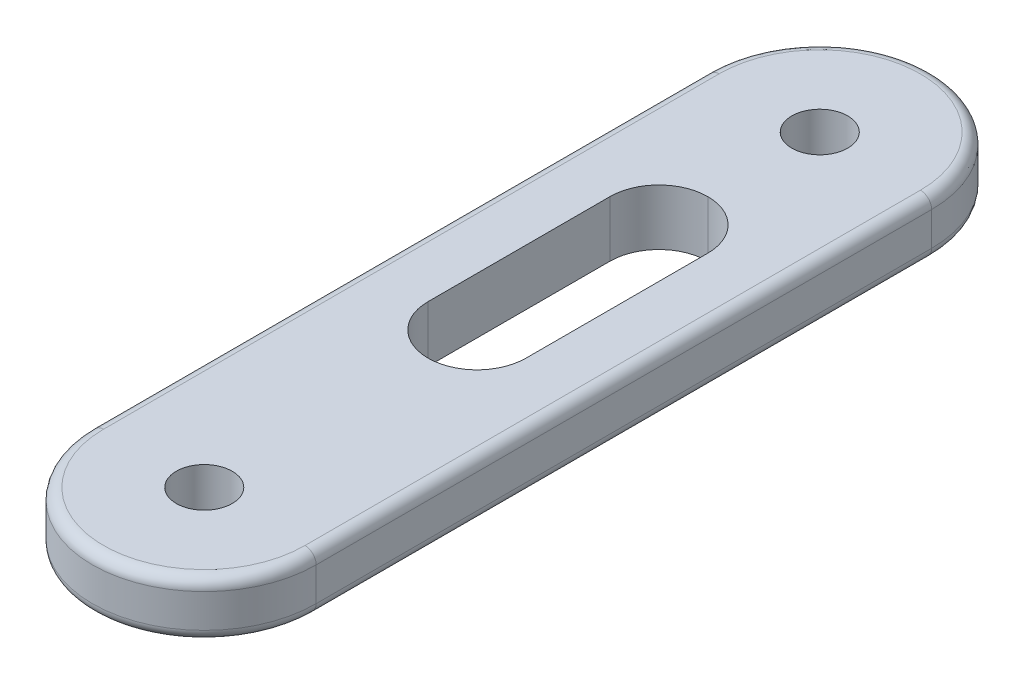
ISO-10303-21;
HEADER;
FILE_DESCRIPTION(('STEP AP214'),'2;1');
FILE_NAME('part.step','',(''),(''),'','','');
FILE_SCHEMA(('AUTOMOTIVE_DESIGN { 1 0 10303 214 1 1 1 1 }'));
ENDSEC;
DATA;
#1=APPLICATION_CONTEXT('core data for automotive mechanical design processes');
#2=APPLICATION_PROTOCOL_DEFINITION('international standard','automotive_design',2000,#1);
#3=PRODUCT_CONTEXT('',#1,'mechanical');
#4=PRODUCT('Part','Part','',(#3));
#5=PRODUCT_RELATED_PRODUCT_CATEGORY('part','',(#4));
#6=PRODUCT_DEFINITION_FORMATION('','',#4);
#7=PRODUCT_DEFINITION_CONTEXT('part definition',#1,'design');
#8=PRODUCT_DEFINITION('design','',#6,#7);
#9=PRODUCT_DEFINITION_SHAPE('','',#8);
#10=(LENGTH_UNIT() NAMED_UNIT(*) SI_UNIT(.MILLI.,.METRE.));
#11=(NAMED_UNIT(*) PLANE_ANGLE_UNIT() SI_UNIT($,.RADIAN.));
#12=(NAMED_UNIT(*) SI_UNIT($,.STERADIAN.) SOLID_ANGLE_UNIT());
#13=UNCERTAINTY_MEASURE_WITH_UNIT(LENGTH_MEASURE(1.E-05),#10,'distance_accuracy_value','');
#14=(GEOMETRIC_REPRESENTATION_CONTEXT(3) GLOBAL_UNCERTAINTY_ASSIGNED_CONTEXT((#13)) GLOBAL_UNIT_ASSIGNED_CONTEXT((#10,
#11,#12)) REPRESENTATION_CONTEXT('',''));
#15=CARTESIAN_POINT('',(0.,0.,0.));
#16=DIRECTION('',(0.,0.,1.));
#17=DIRECTION('',(1.,0.,0.));
#18=AXIS2_PLACEMENT_3D('',#15,#16,#17);
#19=CARTESIAN_POINT('',(0.,6.35,0.));
#20=DIRECTION('',(0.,-1.,0.));
#21=DIRECTION('',(0.,0.,-1.));
#22=AXIS2_PLACEMENT_3D('',#19,#20,#21);
#23=PLANE('',#22);
#24=CARTESIAN_POINT('',(12.7,6.35,-82.55));
#25=DIRECTION('',(0.,-1.,0.));
#26=DIRECTION('',(0.,0.,-1.));
#27=AXIS2_PLACEMENT_3D('',#24,#25,#26);
#28=CIRCLE('',#27,11.43);
#29=CARTESIAN_POINT('',(24.13,6.35,-82.55));
#30=VERTEX_POINT('',#29);
#31=CARTESIAN_POINT('',(1.26999999999999,6.35,-82.55));
#32=VERTEX_POINT('',#31);
#33=EDGE_CURVE('E248',#30,#32,#28,.F.);
#34=ORIENTED_EDGE('',*,*,#33,.T.);
#35=DIRECTION('',(0.,0.,1.));
#36=VECTOR('',#35,1.);
#37=CARTESIAN_POINT('',(1.27,6.35,0.));
#38=LINE('',#37,#36);
#39=CARTESIAN_POINT('',(1.27000000000001,6.35,-12.7));
#40=VERTEX_POINT('',#39);
#41=EDGE_CURVE('E191',#32,#40,#38,.T.);
#42=ORIENTED_EDGE('',*,*,#41,.T.);
#43=CARTESIAN_POINT('',(12.7,6.35,-12.7));
#44=DIRECTION('',(0.,-1.,0.));
#45=DIRECTION('',(0.,0.,-1.));
#46=AXIS2_PLACEMENT_3D('',#43,#44,#45);
#47=CIRCLE('',#46,11.43);
#48=CARTESIAN_POINT('',(24.13,6.35,-12.7));
#49=VERTEX_POINT('',#48);
#50=EDGE_CURVE('E251',#40,#49,#47,.F.);
#51=ORIENTED_EDGE('',*,*,#50,.T.);
#52=DIRECTION('',(0.,0.,-1.));
#53=VECTOR('',#52,1.);
#54=CARTESIAN_POINT('',(24.13,6.35,0.));
#55=LINE('',#54,#53);
#56=EDGE_CURVE('E245',#49,#30,#55,.T.);
#57=ORIENTED_EDGE('',*,*,#56,.T.);
#58=EDGE_LOOP('',(#34,#42,#51,#57));
#59=FACE_BOUND('',#58,.T.);
#60=DIRECTION('',(0.,0.,1.));
#61=VECTOR('',#60,1.);
#62=CARTESIAN_POINT('',(7.14375,6.35,-69.85));
#63=LINE('',#62,#61);
#64=CARTESIAN_POINT('',(7.14375,6.35,-64.29375));
#65=VERTEX_POINT('',#64);
#66=CARTESIAN_POINT('',(7.14375,6.35,-43.65625));
#67=VERTEX_POINT('',#66);
#68=EDGE_CURVE('E347',#65,#67,#63,.T.);
#69=ORIENTED_EDGE('',*,*,#68,.F.);
#70=CARTESIAN_POINT('',(12.7,6.35,-64.29375));
#71=DIRECTION('',(0.,-1.,0.));
#72=DIRECTION('',(0.,0.,-1.));
#73=AXIS2_PLACEMENT_3D('',#70,#71,#72);
#74=CIRCLE('',#73,5.55625);
#75=CARTESIAN_POINT('',(12.7,6.35,-69.85));
#76=VERTEX_POINT('',#75);
#77=EDGE_CURVE('E12',#65,#76,#74,.T.);
#78=ORIENTED_EDGE('',*,*,#77,.T.);
#79=CARTESIAN_POINT('',(12.7,6.35,-64.29375));
#80=DIRECTION('',(0.,-1.,0.));
#81=DIRECTION('',(0.,0.,-1.));
#82=AXIS2_PLACEMENT_3D('',#79,#80,#81);
#83=CIRCLE('',#82,5.55625);
#84=CARTESIAN_POINT('',(18.25625,6.35,-64.29375));
#85=VERTEX_POINT('',#84);
#86=EDGE_CURVE('E315',#76,#85,#83,.T.);
#87=ORIENTED_EDGE('',*,*,#86,.T.);
#88=DIRECTION('',(0.,0.,-1.));
#89=VECTOR('',#88,1.);
#90=CARTESIAN_POINT('',(18.25625,6.35,-69.85));
#91=LINE('',#90,#89);
#92=CARTESIAN_POINT('',(18.25625,6.35,-43.65625));
#93=VERTEX_POINT('',#92);
#94=EDGE_CURVE('E228',#93,#85,#91,.T.);
#95=ORIENTED_EDGE('',*,*,#94,.F.);
#96=CARTESIAN_POINT('',(12.7,6.35,-43.65625));
#97=DIRECTION('',(0.,-1.,0.));
#98=DIRECTION('',(0.,0.,-1.));
#99=AXIS2_PLACEMENT_3D('',#96,#97,#98);
#100=CIRCLE('',#99,5.55625);
#101=CARTESIAN_POINT('',(12.7,6.35,-38.1));
#102=VERTEX_POINT('',#101);
#103=EDGE_CURVE('E310',#93,#102,#100,.T.);
#104=ORIENTED_EDGE('',*,*,#103,.T.);
#105=CARTESIAN_POINT('',(12.7,6.35,-43.65625));
#106=DIRECTION('',(0.,-1.,0.));
#107=DIRECTION('',(0.,0.,-1.));
#108=AXIS2_PLACEMENT_3D('',#105,#106,#107);
#109=CIRCLE('',#108,5.55625);
#110=EDGE_CURVE('E304',#102,#67,#109,.T.);
#111=ORIENTED_EDGE('',*,*,#110,.T.);
#112=EDGE_LOOP('',(#69,#78,#87,#95,#104,#111));
#113=FACE_BOUND('',#112,.T.);
#114=CARTESIAN_POINT('',(12.7,6.35,-82.55));
#115=DIRECTION('',(0.,1.,0.));
#116=DIRECTION('',(0.,0.,1.));
#117=AXIS2_PLACEMENT_3D('',#114,#115,#116);
#118=CIRCLE('',#117,3.17500000000001);
#119=CARTESIAN_POINT('',(12.7,6.35,-79.375));
#120=VERTEX_POINT('',#119);
#121=EDGE_CURVE('E343',#120,#120,#118,.T.);
#122=ORIENTED_EDGE('',*,*,#121,.F.);
#123=EDGE_LOOP('',(#122));
#124=FACE_BOUND('',#123,.T.);
#125=CARTESIAN_POINT('',(12.7,6.35,-12.7));
#126=DIRECTION('',(0.,1.,0.));
#127=DIRECTION('',(0.,0.,1.));
#128=AXIS2_PLACEMENT_3D('',#125,#126,#127);
#129=CIRCLE('',#128,3.175);
#130=CARTESIAN_POINT('',(12.7,6.35,-9.525));
#131=VERTEX_POINT('',#130);
#132=EDGE_CURVE('E359',#131,#131,#129,.T.);
#133=ORIENTED_EDGE('',*,*,#132,.F.);
#134=EDGE_LOOP('',(#133));
#135=FACE_BOUND('',#134,.T.);
#136=ADVANCED_FACE('F75',(#59,#113,#124,#135),#23,.F.);
#137=CARTESIAN_POINT('',(0.,0.,0.));
#138=DIRECTION('',(0.,-1.,0.));
#139=DIRECTION('',(0.,0.,-1.));
#140=AXIS2_PLACEMENT_3D('',#137,#138,#139);
#141=PLANE('',#140);
#142=CARTESIAN_POINT('',(12.7,0.,-12.7));
#143=DIRECTION('',(0.,-1.,0.));
#144=DIRECTION('',(0.,0.,-1.));
#145=AXIS2_PLACEMENT_3D('',#142,#143,#144);
#146=CIRCLE('',#145,11.43);
#147=CARTESIAN_POINT('',(24.13,0.,-12.7));
#148=VERTEX_POINT('',#147);
#149=CARTESIAN_POINT('',(1.27000000000001,0.,-12.7));
#150=VERTEX_POINT('',#149);
#151=EDGE_CURVE('E234',#148,#150,#146,.T.);
#152=ORIENTED_EDGE('',*,*,#151,.T.);
#153=DIRECTION('',(0.,0.,1.));
#154=VECTOR('',#153,1.);
#155=CARTESIAN_POINT('',(1.26999999999999,0.,-82.55));
#156=LINE('',#155,#154);
#157=CARTESIAN_POINT('',(1.26999999999999,0.,-82.55));
#158=VERTEX_POINT('',#157);
#159=EDGE_CURVE('E210',#150,#158,#156,.F.);
#160=ORIENTED_EDGE('',*,*,#159,.T.);
#161=CARTESIAN_POINT('',(12.7,0.,-82.55));
#162=DIRECTION('',(0.,-1.,0.));
#163=DIRECTION('',(0.,0.,-1.));
#164=AXIS2_PLACEMENT_3D('',#161,#162,#163);
#165=CIRCLE('',#164,11.43);
#166=CARTESIAN_POINT('',(24.13,0.,-82.55));
#167=VERTEX_POINT('',#166);
#168=EDGE_CURVE('E226',#158,#167,#165,.T.);
#169=ORIENTED_EDGE('',*,*,#168,.T.);
#170=DIRECTION('',(0.,0.,-1.));
#171=VECTOR('',#170,1.);
#172=CARTESIAN_POINT('',(24.13,0.,-12.7));
#173=LINE('',#172,#171);
#174=EDGE_CURVE('E222',#167,#148,#173,.F.);
#175=ORIENTED_EDGE('',*,*,#174,.T.);
#176=EDGE_LOOP('',(#152,#160,#169,#175));
#177=FACE_BOUND('',#176,.T.);
#178=CARTESIAN_POINT('',(12.7,0.,-82.55));
#179=DIRECTION('',(0.,1.,0.));
#180=DIRECTION('',(0.,0.,1.));
#181=AXIS2_PLACEMENT_3D('',#178,#179,#180);
#182=CIRCLE('',#181,3.17500000000001);
#183=CARTESIAN_POINT('',(12.7,0.,-79.375));
#184=VERTEX_POINT('',#183);
#185=EDGE_CURVE('E349',#184,#184,#182,.T.);
#186=ORIENTED_EDGE('',*,*,#185,.T.);
#187=EDGE_LOOP('',(#186));
#188=FACE_BOUND('',#187,.T.);
#189=CARTESIAN_POINT('',(12.7,0.,-64.29375));
#190=DIRECTION('',(0.,-1.,0.));
#191=DIRECTION('',(0.,0.,-1.));
#192=AXIS2_PLACEMENT_3D('',#189,#190,#191);
#193=CIRCLE('',#192,5.55625);
#194=CARTESIAN_POINT('',(18.25625,0.,-64.29375));
#195=VERTEX_POINT('',#194);
#196=CARTESIAN_POINT('',(12.7,0.,-69.85));
#197=VERTEX_POINT('',#196);
#198=EDGE_CURVE('E99',#195,#197,#193,.F.);
#199=ORIENTED_EDGE('',*,*,#198,.T.);
#200=CARTESIAN_POINT('',(12.7,0.,-64.29375));
#201=DIRECTION('',(0.,-1.,0.));
#202=DIRECTION('',(0.,0.,-1.));
#203=AXIS2_PLACEMENT_3D('',#200,#201,#202);
#204=CIRCLE('',#203,5.55625);
#205=CARTESIAN_POINT('',(7.14375,0.,-64.29375));
#206=VERTEX_POINT('',#205);
#207=EDGE_CURVE('E85',#197,#206,#204,.F.);
#208=ORIENTED_EDGE('',*,*,#207,.T.);
#209=DIRECTION('',(0.,0.,1.));
#210=VECTOR('',#209,1.);
#211=CARTESIAN_POINT('',(7.14375,0.,-69.85));
#212=LINE('',#211,#210);
#213=CARTESIAN_POINT('',(7.14375,0.,-43.65625));
#214=VERTEX_POINT('',#213);
#215=EDGE_CURVE('E336',#206,#214,#212,.T.);
#216=ORIENTED_EDGE('',*,*,#215,.T.);
#217=CARTESIAN_POINT('',(12.7,0.,-43.65625));
#218=DIRECTION('',(0.,-1.,0.));
#219=DIRECTION('',(0.,0.,-1.));
#220=AXIS2_PLACEMENT_3D('',#217,#218,#219);
#221=CIRCLE('',#220,5.55625);
#222=CARTESIAN_POINT('',(12.7,0.,-38.1));
#223=VERTEX_POINT('',#222);
#224=EDGE_CURVE('E301',#214,#223,#221,.F.);
#225=ORIENTED_EDGE('',*,*,#224,.T.);
#226=CARTESIAN_POINT('',(12.7,0.,-43.65625));
#227=DIRECTION('',(0.,-1.,0.));
#228=DIRECTION('',(0.,0.,-1.));
#229=AXIS2_PLACEMENT_3D('',#226,#227,#228);
#230=CIRCLE('',#229,5.55625);
#231=CARTESIAN_POINT('',(18.25625,0.,-43.65625));
#232=VERTEX_POINT('',#231);
#233=EDGE_CURVE('E307',#223,#232,#230,.F.);
#234=ORIENTED_EDGE('',*,*,#233,.T.);
#235=DIRECTION('',(0.,0.,-1.));
#236=VECTOR('',#235,1.);
#237=CARTESIAN_POINT('',(18.25625,0.,-69.85));
#238=LINE('',#237,#236);
#239=EDGE_CURVE('E342',#232,#195,#238,.T.);
#240=ORIENTED_EDGE('',*,*,#239,.T.);
#241=EDGE_LOOP('',(#199,#208,#216,#225,#234,#240));
#242=FACE_BOUND('',#241,.T.);
#243=CARTESIAN_POINT('',(12.7,0.,-12.7));
#244=DIRECTION('',(0.,1.,0.));
#245=DIRECTION('',(0.,0.,1.));
#246=AXIS2_PLACEMENT_3D('',#243,#244,#245);
#247=CIRCLE('',#246,3.175);
#248=CARTESIAN_POINT('',(12.7,0.,-9.525));
#249=VERTEX_POINT('',#248);
#250=EDGE_CURVE('E361',#249,#249,#247,.T.);
#251=ORIENTED_EDGE('',*,*,#250,.T.);
#252=EDGE_LOOP('',(#251));
#253=FACE_BOUND('',#252,.T.);
#254=ADVANCED_FACE('F334',(#177,#188,#242,#253),#141,.T.);
#255=CARTESIAN_POINT('',(0.,6.35,0.));
#256=DIRECTION('',(1.,0.,0.));
#257=DIRECTION('',(0.,0.,-1.));
#258=AXIS2_PLACEMENT_3D('',#255,#256,#257);
#259=PLANE('',#258);
#260=DIRECTION('',(0.,1.,0.));
#261=VECTOR('',#260,1.);
#262=CARTESIAN_POINT('',(0.,0.,-12.7));
#263=LINE('',#262,#261);
#264=CARTESIAN_POINT('',(0.,1.27,-12.7));
#265=VERTEX_POINT('',#264);
#266=CARTESIAN_POINT('',(0.,5.08,-12.7));
#267=VERTEX_POINT('',#266);
#268=EDGE_CURVE('E182',#265,#267,#263,.T.);
#269=ORIENTED_EDGE('',*,*,#268,.T.);
#270=DIRECTION('',(0.,0.,1.));
#271=VECTOR('',#270,1.);
#272=CARTESIAN_POINT('',(0.,5.08,0.));
#273=LINE('',#272,#271);
#274=CARTESIAN_POINT('',(0.,5.08,-82.55));
#275=VERTEX_POINT('',#274);
#276=EDGE_CURVE('E190',#267,#275,#273,.F.);
#277=ORIENTED_EDGE('',*,*,#276,.T.);
#278=DIRECTION('',(0.,1.,0.));
#279=VECTOR('',#278,1.);
#280=CARTESIAN_POINT('',(0.,0.,-82.55));
#281=LINE('',#280,#279);
#282=CARTESIAN_POINT('',(0.,1.27,-82.55));
#283=VERTEX_POINT('',#282);
#284=EDGE_CURVE('E184',#283,#275,#281,.T.);
#285=ORIENTED_EDGE('',*,*,#284,.F.);
#286=DIRECTION('',(0.,0.,1.));
#287=VECTOR('',#286,1.);
#288=CARTESIAN_POINT('',(0.,1.27,-12.7));
#289=LINE('',#288,#287);
#290=EDGE_CURVE('E179',#283,#265,#289,.T.);
#291=ORIENTED_EDGE('',*,*,#290,.T.);
#292=EDGE_LOOP('',(#269,#277,#285,#291));
#293=FACE_BOUND('',#292,.T.);
#294=ADVANCED_FACE('F181',(#293),#259,.F.);
#295=CARTESIAN_POINT('',(25.4,6.35,0.));
#296=DIRECTION('',(-1.,0.,0.));
#297=DIRECTION('',(0.,0.,1.));
#298=AXIS2_PLACEMENT_3D('',#295,#296,#297);
#299=PLANE('',#298);
#300=DIRECTION('',(0.,1.,0.));
#301=VECTOR('',#300,1.);
#302=CARTESIAN_POINT('',(25.4,0.,-12.7));
#303=LINE('',#302,#301);
#304=CARTESIAN_POINT('',(25.4,1.27,-12.7));
#305=VERTEX_POINT('',#304);
#306=CARTESIAN_POINT('',(25.4,5.08,-12.7));
#307=VERTEX_POINT('',#306);
#308=EDGE_CURVE('E368',#305,#307,#303,.T.);
#309=ORIENTED_EDGE('',*,*,#308,.F.);
#310=DIRECTION('',(0.,0.,-1.));
#311=VECTOR('',#310,1.);
#312=CARTESIAN_POINT('',(25.4,1.27,-82.55));
#313=LINE('',#312,#311);
#314=CARTESIAN_POINT('',(25.4,1.27,-82.55));
#315=VERTEX_POINT('',#314);
#316=EDGE_CURVE('E262',#305,#315,#313,.T.);
#317=ORIENTED_EDGE('',*,*,#316,.T.);
#318=DIRECTION('',(0.,1.,0.));
#319=VECTOR('',#318,1.);
#320=CARTESIAN_POINT('',(25.4,0.,-82.55));
#321=LINE('',#320,#319);
#322=CARTESIAN_POINT('',(25.4,5.08,-82.55));
#323=VERTEX_POINT('',#322);
#324=EDGE_CURVE('E204',#315,#323,#321,.T.);
#325=ORIENTED_EDGE('',*,*,#324,.T.);
#326=DIRECTION('',(0.,0.,-1.));
#327=VECTOR('',#326,1.);
#328=CARTESIAN_POINT('',(25.4,5.08,0.));
#329=LINE('',#328,#327);
#330=EDGE_CURVE('E259',#323,#307,#329,.F.);
#331=ORIENTED_EDGE('',*,*,#330,.T.);
#332=EDGE_LOOP('',(#309,#317,#325,#331));
#333=FACE_BOUND('',#332,.T.);
#334=ADVANCED_FACE('F378',(#333),#299,.F.);
#335=CARTESIAN_POINT('',(7.14375,6.35,-69.85));
#336=DIRECTION('',(1.,0.,0.));
#337=DIRECTION('',(0.,0.,-1.));
#338=AXIS2_PLACEMENT_3D('',#335,#336,#337);
#339=PLANE('',#338);
#340=ORIENTED_EDGE('',*,*,#68,.T.);
#341=DIRECTION('',(0.,-1.,0.));
#342=VECTOR('',#341,1.);
#343=CARTESIAN_POINT('',(7.14375,0.,-43.65625));
#344=LINE('',#343,#342);
#345=EDGE_CURVE('E290',#67,#214,#344,.T.);
#346=ORIENTED_EDGE('',*,*,#345,.T.);
#347=ORIENTED_EDGE('',*,*,#215,.F.);
#348=DIRECTION('',(0.,-1.,0.));
#349=VECTOR('',#348,1.);
#350=CARTESIAN_POINT('',(7.14375,6.35,-64.29375));
#351=LINE('',#350,#349);
#352=EDGE_CURVE('E265',#206,#65,#351,.F.);
#353=ORIENTED_EDGE('',*,*,#352,.T.);
#354=EDGE_LOOP('',(#340,#346,#347,#353));
#355=FACE_BOUND('',#354,.T.);
#356=ADVANCED_FACE('F339',(#355),#339,.T.);
#357=CARTESIAN_POINT('',(18.25625,6.35,-69.85));
#358=DIRECTION('',(-1.,0.,0.));
#359=DIRECTION('',(0.,0.,1.));
#360=AXIS2_PLACEMENT_3D('',#357,#358,#359);
#361=PLANE('',#360);
#362=ORIENTED_EDGE('',*,*,#239,.F.);
#363=DIRECTION('',(0.,-1.,0.));
#364=VECTOR('',#363,1.);
#365=CARTESIAN_POINT('',(18.25625,6.35,-43.65625));
#366=LINE('',#365,#364);
#367=EDGE_CURVE('E298',#232,#93,#366,.F.);
#368=ORIENTED_EDGE('',*,*,#367,.T.);
#369=ORIENTED_EDGE('',*,*,#94,.T.);
#370=DIRECTION('',(0.,-1.,0.));
#371=VECTOR('',#370,1.);
#372=CARTESIAN_POINT('',(18.25625,0.,-64.29375));
#373=LINE('',#372,#371);
#374=EDGE_CURVE('E294',#85,#195,#373,.T.);
#375=ORIENTED_EDGE('',*,*,#374,.T.);
#376=EDGE_LOOP('',(#362,#368,#369,#375));
#377=FACE_BOUND('',#376,.T.);
#378=ADVANCED_FACE('F416',(#377),#361,.T.);
#379=CARTESIAN_POINT('',(12.7,6.35,-82.55));
#380=DIRECTION('',(0.,-1.,0.));
#381=DIRECTION('',(0.,0.,-1.));
#382=AXIS2_PLACEMENT_3D('',#379,#380,#381);
#383=CYLINDRICAL_SURFACE('',#382,3.17500000000001);
#384=ORIENTED_EDGE('',*,*,#121,.T.);
#385=EDGE_LOOP('',(#384));
#386=FACE_BOUND('',#385,.T.);
#387=ORIENTED_EDGE('',*,*,#185,.F.);
#388=EDGE_LOOP('',(#387));
#389=FACE_BOUND('',#388,.T.);
#390=ADVANCED_FACE('F413',(#386,#389),#383,.F.);
#391=CARTESIAN_POINT('',(12.7,6.35,-12.7));
#392=DIRECTION('',(0.,-1.,0.));
#393=DIRECTION('',(0.,0.,-1.));
#394=AXIS2_PLACEMENT_3D('',#391,#392,#393);
#395=CYLINDRICAL_SURFACE('',#394,3.175);
#396=ORIENTED_EDGE('',*,*,#132,.T.);
#397=EDGE_LOOP('',(#396));
#398=FACE_BOUND('',#397,.T.);
#399=ORIENTED_EDGE('',*,*,#250,.F.);
#400=EDGE_LOOP('',(#399));
#401=FACE_BOUND('',#400,.T.);
#402=ADVANCED_FACE('F415',(#398,#401),#395,.F.);
#403=CARTESIAN_POINT('',(12.7,0.,-82.55));
#404=DIRECTION('',(0.,1.,0.));
#405=DIRECTION('',(0.,0.,1.));
#406=AXIS2_PLACEMENT_3D('',#403,#404,#405);
#407=CYLINDRICAL_SURFACE('',#406,12.7);
#408=ORIENTED_EDGE('',*,*,#324,.F.);
#409=CARTESIAN_POINT('',(12.7,1.27,-82.55));
#410=DIRECTION('',(0.,-1.,0.));
#411=DIRECTION('',(0.,0.,-1.));
#412=AXIS2_PLACEMENT_3D('',#409,#410,#411);
#413=CIRCLE('',#412,12.7);
#414=EDGE_CURVE('E242',#315,#283,#413,.F.);
#415=ORIENTED_EDGE('',*,*,#414,.T.);
#416=ORIENTED_EDGE('',*,*,#284,.T.);
#417=CARTESIAN_POINT('',(12.7,5.08,-82.55));
#418=DIRECTION('',(0.,-1.,0.));
#419=DIRECTION('',(0.,0.,-1.));
#420=AXIS2_PLACEMENT_3D('',#417,#418,#419);
#421=CIRCLE('',#420,12.7);
#422=EDGE_CURVE('E239',#275,#323,#421,.T.);
#423=ORIENTED_EDGE('',*,*,#422,.T.);
#424=EDGE_LOOP('',(#408,#415,#416,#423));
#425=FACE_BOUND('',#424,.T.);
#426=ADVANCED_FACE('F399',(#425),#407,.T.);
#427=CARTESIAN_POINT('',(12.7,0.,-12.7));
#428=DIRECTION('',(0.,1.,0.));
#429=DIRECTION('',(0.,0.,1.));
#430=AXIS2_PLACEMENT_3D('',#427,#428,#429);
#431=CYLINDRICAL_SURFACE('',#430,12.7);
#432=ORIENTED_EDGE('',*,*,#268,.F.);
#433=CARTESIAN_POINT('',(12.7,1.27,-12.7));
#434=DIRECTION('',(0.,-1.,0.));
#435=DIRECTION('',(0.,0.,-1.));
#436=AXIS2_PLACEMENT_3D('',#433,#434,#435);
#437=CIRCLE('',#436,12.7);
#438=EDGE_CURVE('E199',#265,#305,#437,.F.);
#439=ORIENTED_EDGE('',*,*,#438,.T.);
#440=ORIENTED_EDGE('',*,*,#308,.T.);
#441=CARTESIAN_POINT('',(12.7,5.08,-12.7));
#442=DIRECTION('',(0.,-1.,0.));
#443=DIRECTION('',(0.,0.,-1.));
#444=AXIS2_PLACEMENT_3D('',#441,#442,#443);
#445=CIRCLE('',#444,12.7);
#446=EDGE_CURVE('E202',#307,#267,#445,.T.);
#447=ORIENTED_EDGE('',*,*,#446,.T.);
#448=EDGE_LOOP('',(#432,#439,#440,#447));
#449=FACE_BOUND('',#448,.T.);
#450=ADVANCED_FACE('F196',(#449),#431,.T.);
#451=CARTESIAN_POINT('',(12.7,1.27,-82.55));
#452=DIRECTION('',(0.,-1.,0.));
#453=DIRECTION('',(0.,0.,-1.));
#454=AXIS2_PLACEMENT_3D('',#451,#452,#453);
#455=TOROIDAL_SURFACE('',#454,11.43,1.27);
#456=CARTESIAN_POINT('',(24.13,1.27,-82.55));
#457=DIRECTION('',(0.,0.,1.));
#458=DIRECTION('',(1.,0.,0.));
#459=AXIS2_PLACEMENT_3D('',#456,#457,#458);
#460=CIRCLE('',#459,1.27);
#461=EDGE_CURVE('E215',#167,#315,#460,.T.);
#462=ORIENTED_EDGE('',*,*,#461,.F.);
#463=ORIENTED_EDGE('',*,*,#168,.F.);
#464=CARTESIAN_POINT('',(1.26999999999999,1.27,-82.55));
#465=DIRECTION('',(0.,0.,1.));
#466=DIRECTION('',(1.,0.,0.));
#467=AXIS2_PLACEMENT_3D('',#464,#465,#466);
#468=CIRCLE('',#467,1.27);
#469=EDGE_CURVE('E205',#283,#158,#468,.T.);
#470=ORIENTED_EDGE('',*,*,#469,.F.);
#471=ORIENTED_EDGE('',*,*,#414,.F.);
#472=EDGE_LOOP('',(#462,#463,#470,#471));
#473=FACE_BOUND('',#472,.T.);
#474=ADVANCED_FACE('F402',(#473),#455,.T.);
#475=CARTESIAN_POINT('',(1.27,1.27,0.));
#476=DIRECTION('',(0.,0.,-1.));
#477=DIRECTION('',(-1.,0.,0.));
#478=AXIS2_PLACEMENT_3D('',#475,#476,#477);
#479=CYLINDRICAL_SURFACE('',#478,1.27);
#480=ORIENTED_EDGE('',*,*,#469,.T.);
#481=ORIENTED_EDGE('',*,*,#159,.F.);
#482=CARTESIAN_POINT('',(1.27,1.27,-12.7));
#483=DIRECTION('',(0.,0.,1.));
#484=DIRECTION('',(1.,0.,0.));
#485=AXIS2_PLACEMENT_3D('',#482,#483,#484);
#486=CIRCLE('',#485,1.27);
#487=EDGE_CURVE('E208',#265,#150,#486,.T.);
#488=ORIENTED_EDGE('',*,*,#487,.F.);
#489=ORIENTED_EDGE('',*,*,#290,.F.);
#490=EDGE_LOOP('',(#480,#481,#488,#489));
#491=FACE_BOUND('',#490,.T.);
#492=ADVANCED_FACE('F209',(#491),#479,.T.);
#493=CARTESIAN_POINT('',(24.13,1.27,0.));
#494=DIRECTION('',(0.,0.,1.));
#495=DIRECTION('',(1.,0.,0.));
#496=AXIS2_PLACEMENT_3D('',#493,#494,#495);
#497=CYLINDRICAL_SURFACE('',#496,1.27);
#498=ORIENTED_EDGE('',*,*,#461,.T.);
#499=ORIENTED_EDGE('',*,*,#316,.F.);
#500=CARTESIAN_POINT('',(24.13,1.27,-12.7));
#501=DIRECTION('',(0.,0.,1.));
#502=DIRECTION('',(1.,0.,0.));
#503=AXIS2_PLACEMENT_3D('',#500,#501,#502);
#504=CIRCLE('',#503,1.27);
#505=EDGE_CURVE('E216',#148,#305,#504,.T.);
#506=ORIENTED_EDGE('',*,*,#505,.F.);
#507=ORIENTED_EDGE('',*,*,#174,.F.);
#508=EDGE_LOOP('',(#498,#499,#506,#507));
#509=FACE_BOUND('',#508,.T.);
#510=ADVANCED_FACE('F406',(#509),#497,.T.);
#511=CARTESIAN_POINT('',(12.7,1.27,-12.7));
#512=DIRECTION('',(0.,-1.,0.));
#513=DIRECTION('',(0.,0.,-1.));
#514=AXIS2_PLACEMENT_3D('',#511,#512,#513);
#515=TOROIDAL_SURFACE('',#514,11.43,1.27);
#516=ORIENTED_EDGE('',*,*,#487,.T.);
#517=ORIENTED_EDGE('',*,*,#151,.F.);
#518=ORIENTED_EDGE('',*,*,#505,.T.);
#519=ORIENTED_EDGE('',*,*,#438,.F.);
#520=EDGE_LOOP('',(#516,#517,#518,#519));
#521=FACE_BOUND('',#520,.T.);
#522=ADVANCED_FACE('F218',(#521),#515,.T.);
#523=CARTESIAN_POINT('',(12.7,5.08,-82.55));
#524=DIRECTION('',(0.,-1.,0.));
#525=DIRECTION('',(0.,0.,-1.));
#526=AXIS2_PLACEMENT_3D('',#523,#524,#525);
#527=TOROIDAL_SURFACE('',#526,11.43,1.27);
#528=CARTESIAN_POINT('',(24.13,5.08,-82.55));
#529=DIRECTION('',(0.,0.,1.));
#530=DIRECTION('',(1.,0.,0.));
#531=AXIS2_PLACEMENT_3D('',#528,#529,#530);
#532=CIRCLE('',#531,1.27);
#533=EDGE_CURVE('E281',#323,#30,#532,.T.);
#534=ORIENTED_EDGE('',*,*,#533,.F.);
#535=ORIENTED_EDGE('',*,*,#422,.F.);
#536=CARTESIAN_POINT('',(1.26999999999999,5.08,-82.55));
#537=DIRECTION('',(0.,0.,1.));
#538=DIRECTION('',(1.,0.,0.));
#539=AXIS2_PLACEMENT_3D('',#536,#537,#538);
#540=CIRCLE('',#539,1.27);
#541=EDGE_CURVE('E267',#32,#275,#540,.T.);
#542=ORIENTED_EDGE('',*,*,#541,.F.);
#543=ORIENTED_EDGE('',*,*,#33,.F.);
#544=EDGE_LOOP('',(#534,#535,#542,#543));
#545=FACE_BOUND('',#544,.T.);
#546=ADVANCED_FACE('F385',(#545),#527,.T.);
#547=CARTESIAN_POINT('',(1.27,5.08,0.));
#548=DIRECTION('',(0.,0.,1.));
#549=DIRECTION('',(1.,0.,0.));
#550=AXIS2_PLACEMENT_3D('',#547,#548,#549);
#551=CYLINDRICAL_SURFACE('',#550,1.27);
#552=ORIENTED_EDGE('',*,*,#541,.T.);
#553=ORIENTED_EDGE('',*,*,#276,.F.);
#554=CARTESIAN_POINT('',(1.27,5.08,-12.7));
#555=DIRECTION('',(0.,0.,1.));
#556=DIRECTION('',(1.,0.,0.));
#557=AXIS2_PLACEMENT_3D('',#554,#555,#556);
#558=CIRCLE('',#557,1.27);
#559=EDGE_CURVE('E277',#40,#267,#558,.T.);
#560=ORIENTED_EDGE('',*,*,#559,.F.);
#561=ORIENTED_EDGE('',*,*,#41,.F.);
#562=EDGE_LOOP('',(#552,#553,#560,#561));
#563=FACE_BOUND('',#562,.T.);
#564=ADVANCED_FACE('F398',(#563),#551,.T.);
#565=CARTESIAN_POINT('',(24.13,5.08,0.));
#566=DIRECTION('',(0.,0.,-1.));
#567=DIRECTION('',(-1.,0.,0.));
#568=AXIS2_PLACEMENT_3D('',#565,#566,#567);
#569=CYLINDRICAL_SURFACE('',#568,1.27);
#570=ORIENTED_EDGE('',*,*,#533,.T.);
#571=ORIENTED_EDGE('',*,*,#56,.F.);
#572=CARTESIAN_POINT('',(24.13,5.08,-12.7));
#573=DIRECTION('',(0.,0.,1.));
#574=DIRECTION('',(1.,0.,0.));
#575=AXIS2_PLACEMENT_3D('',#572,#573,#574);
#576=CIRCLE('',#575,1.27);
#577=EDGE_CURVE('E274',#307,#49,#576,.T.);
#578=ORIENTED_EDGE('',*,*,#577,.F.);
#579=ORIENTED_EDGE('',*,*,#330,.F.);
#580=EDGE_LOOP('',(#570,#571,#578,#579));
#581=FACE_BOUND('',#580,.T.);
#582=ADVANCED_FACE('F390',(#581),#569,.T.);
#583=CARTESIAN_POINT('',(12.7,5.08,-12.7));
#584=DIRECTION('',(0.,-1.,0.));
#585=DIRECTION('',(0.,0.,-1.));
#586=AXIS2_PLACEMENT_3D('',#583,#584,#585);
#587=TOROIDAL_SURFACE('',#586,11.43,1.27);
#588=ORIENTED_EDGE('',*,*,#559,.T.);
#589=ORIENTED_EDGE('',*,*,#446,.F.);
#590=ORIENTED_EDGE('',*,*,#577,.T.);
#591=ORIENTED_EDGE('',*,*,#50,.F.);
#592=EDGE_LOOP('',(#588,#589,#590,#591));
#593=FACE_BOUND('',#592,.T.);
#594=ADVANCED_FACE('F393',(#593),#587,.T.);
#595=CARTESIAN_POINT('',(12.7,6.35,-43.65625));
#596=DIRECTION('',(0.,1.,0.));
#597=DIRECTION('',(0.,0.,1.));
#598=AXIS2_PLACEMENT_3D('',#595,#596,#597);
#599=CYLINDRICAL_SURFACE('',#598,5.55625);
#600=DIRECTION('',(0.,-1.,0.));
#601=VECTOR('',#600,1.);
#602=CARTESIAN_POINT('',(12.7,0.,-38.1));
#603=LINE('',#602,#601);
#604=EDGE_CURVE('E278',#102,#223,#603,.T.);
#605=ORIENTED_EDGE('',*,*,#604,.F.);
#606=ORIENTED_EDGE('',*,*,#103,.F.);
#607=ORIENTED_EDGE('',*,*,#367,.F.);
#608=ORIENTED_EDGE('',*,*,#233,.F.);
#609=EDGE_LOOP('',(#605,#606,#607,#608));
#610=FACE_BOUND('',#609,.T.);
#611=ADVANCED_FACE('F448',(#610),#599,.F.);
#612=CARTESIAN_POINT('',(12.7,6.35,-43.65625));
#613=DIRECTION('',(0.,1.,0.));
#614=DIRECTION('',(0.,0.,1.));
#615=AXIS2_PLACEMENT_3D('',#612,#613,#614);
#616=CYLINDRICAL_SURFACE('',#615,5.55625);
#617=ORIENTED_EDGE('',*,*,#110,.F.);
#618=ORIENTED_EDGE('',*,*,#604,.T.);
#619=ORIENTED_EDGE('',*,*,#224,.F.);
#620=ORIENTED_EDGE('',*,*,#345,.F.);
#621=EDGE_LOOP('',(#617,#618,#619,#620));
#622=FACE_BOUND('',#621,.T.);
#623=ADVANCED_FACE('F455',(#622),#616,.F.);
#624=CARTESIAN_POINT('',(12.7,6.35,-64.29375));
#625=DIRECTION('',(0.,1.,0.));
#626=DIRECTION('',(0.,0.,1.));
#627=AXIS2_PLACEMENT_3D('',#624,#625,#626);
#628=CYLINDRICAL_SURFACE('',#627,5.55625);
#629=DIRECTION('',(0.,-1.,0.));
#630=VECTOR('',#629,1.);
#631=CARTESIAN_POINT('',(12.7,0.,-69.85));
#632=LINE('',#631,#630);
#633=EDGE_CURVE('E79',#76,#197,#632,.T.);
#634=ORIENTED_EDGE('',*,*,#633,.F.);
#635=ORIENTED_EDGE('',*,*,#77,.F.);
#636=ORIENTED_EDGE('',*,*,#352,.F.);
#637=ORIENTED_EDGE('',*,*,#207,.F.);
#638=EDGE_LOOP('',(#634,#635,#636,#637));
#639=FACE_BOUND('',#638,.T.);
#640=ADVANCED_FACE('F77',(#639),#628,.F.);
#641=CARTESIAN_POINT('',(12.7,6.35,-64.29375));
#642=DIRECTION('',(0.,1.,0.));
#643=DIRECTION('',(0.,0.,1.));
#644=AXIS2_PLACEMENT_3D('',#641,#642,#643);
#645=CYLINDRICAL_SURFACE('',#644,5.55625);
#646=ORIENTED_EDGE('',*,*,#86,.F.);
#647=ORIENTED_EDGE('',*,*,#633,.T.);
#648=ORIENTED_EDGE('',*,*,#198,.F.);
#649=ORIENTED_EDGE('',*,*,#374,.F.);
#650=EDGE_LOOP('',(#646,#647,#648,#649));
#651=FACE_BOUND('',#650,.T.);
#652=ADVANCED_FACE('F328',(#651),#645,.F.);
#653=CLOSED_SHELL('',(#136,#254,#294,#334,#356,#378,#390,#402,#426,#450,#474,#492,#510,#522,
#546,#564,#582,#594,#611,#623,#640,#652));
#654=MANIFOLD_SOLID_BREP('B2',#653);
#655=ADVANCED_BREP_SHAPE_REPRESENTATION('',(#18,#654),#14);
#656=SHAPE_DEFINITION_REPRESENTATION(#9,#655);
ENDSEC;
END-ISO-10303-21;
